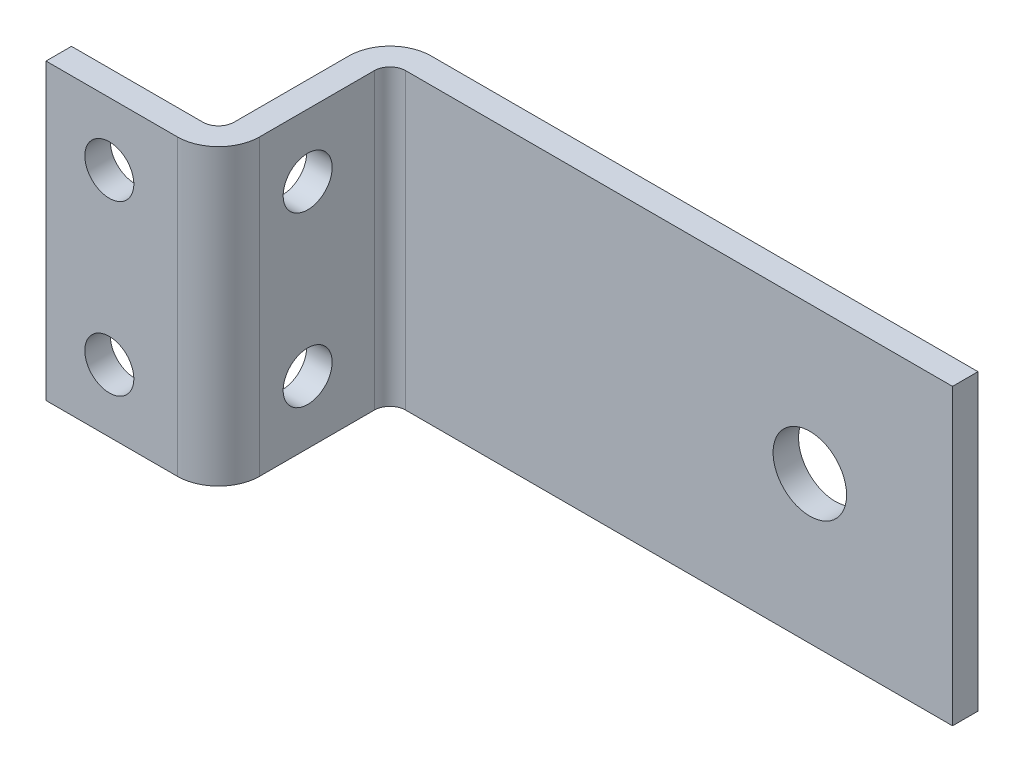
ISO-10303-21;
HEADER;
FILE_DESCRIPTION(('STEP AP214'),'2;1');
FILE_NAME('part.step','',(''),(''),'','','');
FILE_SCHEMA(('AUTOMOTIVE_DESIGN { 1 0 10303 214 1 1 1 1 }'));
ENDSEC;
DATA;
#1=APPLICATION_CONTEXT('core data for automotive mechanical design processes');
#2=APPLICATION_PROTOCOL_DEFINITION('international standard','automotive_design',2000,#1);
#3=PRODUCT_CONTEXT('',#1,'mechanical');
#4=PRODUCT('Part','Part','',(#3));
#5=PRODUCT_RELATED_PRODUCT_CATEGORY('part','',(#4));
#6=PRODUCT_DEFINITION_FORMATION('','',#4);
#7=PRODUCT_DEFINITION_CONTEXT('part definition',#1,'design');
#8=PRODUCT_DEFINITION('design','',#6,#7);
#9=PRODUCT_DEFINITION_SHAPE('','',#8);
#10=(LENGTH_UNIT() NAMED_UNIT(*) SI_UNIT(.MILLI.,.METRE.));
#11=(NAMED_UNIT(*) PLANE_ANGLE_UNIT() SI_UNIT($,.RADIAN.));
#12=(NAMED_UNIT(*) SI_UNIT($,.STERADIAN.) SOLID_ANGLE_UNIT());
#13=UNCERTAINTY_MEASURE_WITH_UNIT(LENGTH_MEASURE(1.E-05),#10,'distance_accuracy_value','');
#14=(GEOMETRIC_REPRESENTATION_CONTEXT(3) GLOBAL_UNCERTAINTY_ASSIGNED_CONTEXT((#13)) GLOBAL_UNIT_ASSIGNED_CONTEXT((#10,
#11,#12)) REPRESENTATION_CONTEXT('',''));
#15=CARTESIAN_POINT('',(0.,0.,0.));
#16=DIRECTION('',(0.,0.,1.));
#17=DIRECTION('',(1.,0.,0.));
#18=AXIS2_PLACEMENT_3D('',#15,#16,#17);
#19=CARTESIAN_POINT('',(-2.032,19.05,22.225));
#20=DIRECTION('',(0.,0.,-1.));
#21=DIRECTION('',(-1.,0.,0.));
#22=AXIS2_PLACEMENT_3D('',#19,#20,#21);
#23=PLANE('',#22);
#24=CARTESIAN_POINT('',(-10.8458,10.922,22.225));
#25=DIRECTION('',(0.,0.,-1.));
#26=DIRECTION('',(-1.,0.,0.));
#27=AXIS2_PLACEMENT_3D('',#24,#25,#26);
#28=CIRCLE('',#27,3.175);
#29=CARTESIAN_POINT('',(-14.0208,10.922,22.225));
#30=VERTEX_POINT('',#29);
#31=EDGE_CURVE('E170',#30,#30,#28,.F.);
#32=ORIENTED_EDGE('',*,*,#31,.T.);
#33=EDGE_LOOP('',(#32));
#34=FACE_BOUND('',#33,.T.);
#35=DIRECTION('',(1.,0.,0.));
#36=VECTOR('',#35,1.);
#37=CARTESIAN_POINT('',(-2.032,-19.05,22.225));
#38=LINE('',#37,#36);
#39=CARTESIAN_POINT('',(-19.05,-19.05,22.225));
#40=VERTEX_POINT('',#39);
#41=CARTESIAN_POINT('',(-2.032,-19.05,22.225));
#42=VERTEX_POINT('',#41);
#43=EDGE_CURVE('E190',#40,#42,#38,.T.);
#44=ORIENTED_EDGE('',*,*,#43,.F.);
#45=DIRECTION('',(0.,-1.,0.));
#46=VECTOR('',#45,1.);
#47=CARTESIAN_POINT('',(-19.05,19.05,22.225));
#48=LINE('',#47,#46);
#49=CARTESIAN_POINT('',(-19.05,19.05,22.225));
#50=VERTEX_POINT('',#49);
#51=EDGE_CURVE('E216',#50,#40,#48,.T.);
#52=ORIENTED_EDGE('',*,*,#51,.F.);
#53=DIRECTION('',(1.,0.,0.));
#54=VECTOR('',#53,1.);
#55=CARTESIAN_POINT('',(-2.032,19.05,22.225));
#56=LINE('',#55,#54);
#57=CARTESIAN_POINT('',(-2.032,19.05,22.225));
#58=VERTEX_POINT('',#57);
#59=EDGE_CURVE('E269',#50,#58,#56,.T.);
#60=ORIENTED_EDGE('',*,*,#59,.T.);
#61=DIRECTION('',(0.,-1.,0.));
#62=VECTOR('',#61,1.);
#63=CARTESIAN_POINT('',(-2.032,19.05,22.225));
#64=LINE('',#63,#62);
#65=EDGE_CURVE('E219',#58,#42,#64,.T.);
#66=ORIENTED_EDGE('',*,*,#65,.T.);
#67=EDGE_LOOP('',(#44,#52,#60,#66));
#68=FACE_BOUND('',#67,.T.);
#69=CARTESIAN_POINT('',(-10.8458,-10.922,22.225));
#70=DIRECTION('',(0.,0.,-1.));
#71=DIRECTION('',(-1.,0.,0.));
#72=AXIS2_PLACEMENT_3D('',#69,#70,#71);
#73=CIRCLE('',#72,3.175);
#74=CARTESIAN_POINT('',(-14.0208,-10.922,22.225));
#75=VERTEX_POINT('',#74);
#76=EDGE_CURVE('E301',#75,#75,#73,.F.);
#77=ORIENTED_EDGE('',*,*,#76,.T.);
#78=EDGE_LOOP('',(#77));
#79=FACE_BOUND('',#78,.T.);
#80=ADVANCED_FACE('F39',(#34,#68,#79),#23,.T.);
#81=CARTESIAN_POINT('',(-2.032,19.05,25.527));
#82=DIRECTION('',(0.,0.,-1.));
#83=DIRECTION('',(-1.,0.,0.));
#84=AXIS2_PLACEMENT_3D('',#81,#82,#83);
#85=PLANE('',#84);
#86=DIRECTION('',(1.,0.,0.));
#87=VECTOR('',#86,1.);
#88=CARTESIAN_POINT('',(-2.032,-19.05,25.527));
#89=LINE('',#88,#87);
#90=CARTESIAN_POINT('',(-19.05,-19.05,25.527));
#91=VERTEX_POINT('',#90);
#92=CARTESIAN_POINT('',(-2.032,-19.05,25.527));
#93=VERTEX_POINT('',#92);
#94=EDGE_CURVE('E198',#91,#93,#89,.T.);
#95=ORIENTED_EDGE('',*,*,#94,.T.);
#96=DIRECTION('',(0.,-1.,0.));
#97=VECTOR('',#96,1.);
#98=CARTESIAN_POINT('',(-2.032,19.05,25.527));
#99=LINE('',#98,#97);
#100=CARTESIAN_POINT('',(-2.032,19.05,25.527));
#101=VERTEX_POINT('',#100);
#102=EDGE_CURVE('E154',#101,#93,#99,.T.);
#103=ORIENTED_EDGE('',*,*,#102,.F.);
#104=DIRECTION('',(1.,0.,0.));
#105=VECTOR('',#104,1.);
#106=CARTESIAN_POINT('',(-2.032,19.05,25.527));
#107=LINE('',#106,#105);
#108=CARTESIAN_POINT('',(-19.05,19.05,25.527));
#109=VERTEX_POINT('',#108);
#110=EDGE_CURVE('E143',#109,#101,#107,.T.);
#111=ORIENTED_EDGE('',*,*,#110,.F.);
#112=DIRECTION('',(0.,-1.,0.));
#113=VECTOR('',#112,1.);
#114=CARTESIAN_POINT('',(-19.05,19.05,25.527));
#115=LINE('',#114,#113);
#116=EDGE_CURVE('E213',#109,#91,#115,.T.);
#117=ORIENTED_EDGE('',*,*,#116,.T.);
#118=EDGE_LOOP('',(#95,#103,#111,#117));
#119=FACE_BOUND('',#118,.T.);
#120=CARTESIAN_POINT('',(-10.8458,10.922,25.527));
#121=DIRECTION('',(0.,0.,-1.));
#122=DIRECTION('',(-1.,0.,0.));
#123=AXIS2_PLACEMENT_3D('',#120,#121,#122);
#124=CIRCLE('',#123,3.175);
#125=CARTESIAN_POINT('',(-14.0208,10.922,25.527));
#126=VERTEX_POINT('',#125);
#127=EDGE_CURVE('E295',#126,#126,#124,.T.);
#128=ORIENTED_EDGE('',*,*,#127,.T.);
#129=EDGE_LOOP('',(#128));
#130=FACE_BOUND('',#129,.T.);
#131=CARTESIAN_POINT('',(-10.8458,-10.922,25.527));
#132=DIRECTION('',(0.,0.,-1.));
#133=DIRECTION('',(-1.,0.,0.));
#134=AXIS2_PLACEMENT_3D('',#131,#132,#133);
#135=CIRCLE('',#134,3.175);
#136=CARTESIAN_POINT('',(-14.0208,-10.922,25.527));
#137=VERTEX_POINT('',#136);
#138=EDGE_CURVE('E298',#137,#137,#135,.T.);
#139=ORIENTED_EDGE('',*,*,#138,.T.);
#140=EDGE_LOOP('',(#139));
#141=FACE_BOUND('',#140,.T.);
#142=ADVANCED_FACE('F288',(#119,#130,#141),#85,.F.);
#143=CARTESIAN_POINT('',(5.334,19.05,3.302));
#144=DIRECTION('',(0.,0.,-1.));
#145=DIRECTION('',(-1.,0.,0.));
#146=AXIS2_PLACEMENT_3D('',#143,#144,#145);
#147=PLANE('',#146);
#148=CARTESIAN_POINT('',(57.7088,0.,3.302));
#149=DIRECTION('',(0.,0.,1.));
#150=DIRECTION('',(1.,0.,0.));
#151=AXIS2_PLACEMENT_3D('',#148,#149,#150);
#152=CIRCLE('',#151,4.7625);
#153=CARTESIAN_POINT('',(62.4713,0.,3.302));
#154=VERTEX_POINT('',#153);
#155=EDGE_CURVE('E363',#154,#154,#152,.T.);
#156=ORIENTED_EDGE('',*,*,#155,.F.);
#157=EDGE_LOOP('',(#156));
#158=FACE_BOUND('',#157,.T.);
#159=DIRECTION('',(1.,0.,0.));
#160=VECTOR('',#159,1.);
#161=CARTESIAN_POINT('',(5.334,-19.05,3.302));
#162=LINE('',#161,#160);
#163=CARTESIAN_POINT('',(5.334,-19.05,3.302));
#164=VERTEX_POINT('',#163);
#165=CARTESIAN_POINT('',(76.2,-19.05,3.302));
#166=VERTEX_POINT('',#165);
#167=EDGE_CURVE('E165',#164,#166,#162,.T.);
#168=ORIENTED_EDGE('',*,*,#167,.T.);
#169=DIRECTION('',(0.,-1.,0.));
#170=VECTOR('',#169,1.);
#171=CARTESIAN_POINT('',(76.2,19.05,3.302));
#172=LINE('',#171,#170);
#173=CARTESIAN_POINT('',(76.2,19.05,3.302));
#174=VERTEX_POINT('',#173);
#175=EDGE_CURVE('E11',#174,#166,#172,.T.);
#176=ORIENTED_EDGE('',*,*,#175,.F.);
#177=DIRECTION('',(1.,0.,0.));
#178=VECTOR('',#177,1.);
#179=CARTESIAN_POINT('',(5.334,19.05,3.302));
#180=LINE('',#179,#178);
#181=CARTESIAN_POINT('',(5.334,19.05,3.302));
#182=VERTEX_POINT('',#181);
#183=EDGE_CURVE('E109',#182,#174,#180,.T.);
#184=ORIENTED_EDGE('',*,*,#183,.F.);
#185=DIRECTION('',(0.,-1.,0.));
#186=VECTOR('',#185,1.);
#187=CARTESIAN_POINT('',(5.334,19.05,3.302));
#188=LINE('',#187,#186);
#189=EDGE_CURVE('E161',#182,#164,#188,.T.);
#190=ORIENTED_EDGE('',*,*,#189,.T.);
#191=EDGE_LOOP('',(#168,#176,#184,#190));
#192=FACE_BOUND('',#191,.T.);
#193=ADVANCED_FACE('F41',(#158,#192),#147,.F.);
#194=CARTESIAN_POINT('',(76.2,19.05,0.));
#195=DIRECTION('',(1.,0.,0.));
#196=DIRECTION('',(0.,0.,-1.));
#197=AXIS2_PLACEMENT_3D('',#194,#195,#196);
#198=PLANE('',#197);
#199=DIRECTION('',(0.,0.,1.));
#200=VECTOR('',#199,1.);
#201=CARTESIAN_POINT('',(76.2,-19.05,0.));
#202=LINE('',#201,#200);
#203=CARTESIAN_POINT('',(76.2,-19.05,0.));
#204=VERTEX_POINT('',#203);
#205=EDGE_CURVE('E169',#204,#166,#202,.T.);
#206=ORIENTED_EDGE('',*,*,#205,.F.);
#207=DIRECTION('',(0.,-1.,0.));
#208=VECTOR('',#207,1.);
#209=CARTESIAN_POINT('',(76.2,19.05,0.));
#210=LINE('',#209,#208);
#211=CARTESIAN_POINT('',(76.2,19.05,0.));
#212=VERTEX_POINT('',#211);
#213=EDGE_CURVE('E49',#212,#204,#210,.T.);
#214=ORIENTED_EDGE('',*,*,#213,.F.);
#215=DIRECTION('',(0.,0.,1.));
#216=VECTOR('',#215,1.);
#217=CARTESIAN_POINT('',(76.2,19.05,0.));
#218=LINE('',#217,#216);
#219=EDGE_CURVE('E253',#212,#174,#218,.T.);
#220=ORIENTED_EDGE('',*,*,#219,.T.);
#221=ORIENTED_EDGE('',*,*,#175,.T.);
#222=EDGE_LOOP('',(#206,#214,#220,#221));
#223=FACE_BOUND('',#222,.T.);
#224=ADVANCED_FACE('F240',(#223),#198,.T.);
#225=CARTESIAN_POINT('',(5.334,19.05,0.));
#226=DIRECTION('',(0.,0.,-1.));
#227=DIRECTION('',(-1.,0.,0.));
#228=AXIS2_PLACEMENT_3D('',#225,#226,#227);
#229=PLANE('',#228);
#230=CARTESIAN_POINT('',(57.7088,0.,0.));
#231=DIRECTION('',(0.,0.,1.));
#232=DIRECTION('',(1.,0.,0.));
#233=AXIS2_PLACEMENT_3D('',#230,#231,#232);
#234=CIRCLE('',#233,4.7625);
#235=CARTESIAN_POINT('',(62.4713,0.,0.));
#236=VERTEX_POINT('',#235);
#237=EDGE_CURVE('E501',#236,#236,#234,.T.);
#238=ORIENTED_EDGE('',*,*,#237,.T.);
#239=EDGE_LOOP('',(#238));
#240=FACE_BOUND('',#239,.T.);
#241=DIRECTION('',(1.,0.,0.));
#242=VECTOR('',#241,1.);
#243=CARTESIAN_POINT('',(5.334,-19.05,0.));
#244=LINE('',#243,#242);
#245=CARTESIAN_POINT('',(5.334,-19.05,0.));
#246=VERTEX_POINT('',#245);
#247=EDGE_CURVE('E174',#246,#204,#244,.T.);
#248=ORIENTED_EDGE('',*,*,#247,.F.);
#249=DIRECTION('',(0.,-1.,0.));
#250=VECTOR('',#249,1.);
#251=CARTESIAN_POINT('',(5.334,19.05,0.));
#252=LINE('',#251,#250);
#253=CARTESIAN_POINT('',(5.334,19.05,0.));
#254=VERTEX_POINT('',#253);
#255=EDGE_CURVE('E228',#254,#246,#252,.T.);
#256=ORIENTED_EDGE('',*,*,#255,.F.);
#257=DIRECTION('',(1.,0.,0.));
#258=VECTOR('',#257,1.);
#259=CARTESIAN_POINT('',(5.334,19.05,0.));
#260=LINE('',#259,#258);
#261=EDGE_CURVE('E237',#254,#212,#260,.T.);
#262=ORIENTED_EDGE('',*,*,#261,.T.);
#263=ORIENTED_EDGE('',*,*,#213,.T.);
#264=EDGE_LOOP('',(#248,#256,#262,#263));
#265=FACE_BOUND('',#264,.T.);
#266=ADVANCED_FACE('F235',(#240,#265),#229,.T.);
#267=CARTESIAN_POINT('',(5.334,19.05,5.334));
#268=DIRECTION('',(0.,-1.,0.));
#269=DIRECTION('',(0.,0.,-1.));
#270=AXIS2_PLACEMENT_3D('',#267,#268,#269);
#271=CYLINDRICAL_SURFACE('',#270,5.334);
#272=CARTESIAN_POINT('',(5.334,-19.05,5.334));
#273=DIRECTION('',(0.,-1.,0.));
#274=DIRECTION('',(0.,0.,-1.));
#275=AXIS2_PLACEMENT_3D('',#272,#273,#274);
#276=CIRCLE('',#275,5.334);
#277=CARTESIAN_POINT('',(0.,-19.05,5.334));
#278=VERTEX_POINT('',#277);
#279=EDGE_CURVE('E178',#278,#246,#276,.T.);
#280=ORIENTED_EDGE('',*,*,#279,.F.);
#281=DIRECTION('',(0.,-1.,0.));
#282=VECTOR('',#281,1.);
#283=CARTESIAN_POINT('',(0.,19.05,5.334));
#284=LINE('',#283,#282);
#285=CARTESIAN_POINT('',(0.,19.05,5.334));
#286=VERTEX_POINT('',#285);
#287=EDGE_CURVE('E225',#286,#278,#284,.T.);
#288=ORIENTED_EDGE('',*,*,#287,.F.);
#289=CARTESIAN_POINT('',(5.334,19.05,5.334));
#290=DIRECTION('',(0.,-1.,0.));
#291=DIRECTION('',(0.,0.,-1.));
#292=AXIS2_PLACEMENT_3D('',#289,#290,#291);
#293=CIRCLE('',#292,5.334);
#294=EDGE_CURVE('E250',#286,#254,#293,.T.);
#295=ORIENTED_EDGE('',*,*,#294,.T.);
#296=ORIENTED_EDGE('',*,*,#255,.T.);
#297=EDGE_LOOP('',(#280,#288,#295,#296));
#298=FACE_BOUND('',#297,.T.);
#299=ADVANCED_FACE('F247',(#298),#271,.T.);
#300=CARTESIAN_POINT('',(0.,19.05,20.193));
#301=DIRECTION('',(-1.,0.,0.));
#302=DIRECTION('',(0.,0.,1.));
#303=AXIS2_PLACEMENT_3D('',#300,#301,#302);
#304=PLANE('',#303);
#305=CARTESIAN_POINT('',(0.,-10.922,13.97));
#306=DIRECTION('',(-1.,0.,0.));
#307=DIRECTION('',(0.,0.,1.));
#308=AXIS2_PLACEMENT_3D('',#305,#306,#307);
#309=CIRCLE('',#308,3.175);
#310=CARTESIAN_POINT('',(0.,-10.922,17.145));
#311=VERTEX_POINT('',#310);
#312=EDGE_CURVE('E492',#311,#311,#309,.T.);
#313=ORIENTED_EDGE('',*,*,#312,.F.);
#314=EDGE_LOOP('',(#313));
#315=FACE_BOUND('',#314,.T.);
#316=CARTESIAN_POINT('',(0.,10.922,13.97));
#317=DIRECTION('',(-1.,0.,0.));
#318=DIRECTION('',(0.,0.,1.));
#319=AXIS2_PLACEMENT_3D('',#316,#317,#318);
#320=CIRCLE('',#319,3.175);
#321=CARTESIAN_POINT('',(0.,10.922,17.145));
#322=VERTEX_POINT('',#321);
#323=EDGE_CURVE('E302',#322,#322,#320,.T.);
#324=ORIENTED_EDGE('',*,*,#323,.F.);
#325=EDGE_LOOP('',(#324));
#326=FACE_BOUND('',#325,.T.);
#327=DIRECTION('',(0.,0.,-1.));
#328=VECTOR('',#327,1.);
#329=CARTESIAN_POINT('',(0.,-19.05,20.193));
#330=LINE('',#329,#328);
#331=CARTESIAN_POINT('',(0.,-19.05,20.193));
#332=VERTEX_POINT('',#331);
#333=EDGE_CURVE('E182',#332,#278,#330,.T.);
#334=ORIENTED_EDGE('',*,*,#333,.F.);
#335=DIRECTION('',(0.,-1.,0.));
#336=VECTOR('',#335,1.);
#337=CARTESIAN_POINT('',(0.,19.05,20.193));
#338=LINE('',#337,#336);
#339=CARTESIAN_POINT('',(0.,19.05,20.193));
#340=VERTEX_POINT('',#339);
#341=EDGE_CURVE('E222',#340,#332,#338,.T.);
#342=ORIENTED_EDGE('',*,*,#341,.F.);
#343=DIRECTION('',(0.,0.,-1.));
#344=VECTOR('',#343,1.);
#345=CARTESIAN_POINT('',(0.,19.05,20.193));
#346=LINE('',#345,#344);
#347=EDGE_CURVE('E258',#340,#286,#346,.T.);
#348=ORIENTED_EDGE('',*,*,#347,.T.);
#349=ORIENTED_EDGE('',*,*,#287,.T.);
#350=EDGE_LOOP('',(#334,#342,#348,#349));
#351=FACE_BOUND('',#350,.T.);
#352=ADVANCED_FACE('F344',(#315,#326,#351),#304,.T.);
#353=CARTESIAN_POINT('',(-2.032,19.05,20.193));
#354=DIRECTION('',(0.,-1.,0.));
#355=DIRECTION('',(0.,0.,-1.));
#356=AXIS2_PLACEMENT_3D('',#353,#354,#355);
#357=CYLINDRICAL_SURFACE('',#356,2.032);
#358=CARTESIAN_POINT('',(-2.032,-19.05,20.193));
#359=DIRECTION('',(0.,1.,0.));
#360=DIRECTION('',(0.,0.,-1.));
#361=AXIS2_PLACEMENT_3D('',#358,#359,#360);
#362=CIRCLE('',#361,2.032);
#363=EDGE_CURVE('E186',#42,#332,#362,.T.);
#364=ORIENTED_EDGE('',*,*,#363,.F.);
#365=ORIENTED_EDGE('',*,*,#65,.F.);
#366=CARTESIAN_POINT('',(-2.032,19.05,20.193));
#367=DIRECTION('',(0.,1.,0.));
#368=DIRECTION('',(0.,0.,-1.));
#369=AXIS2_PLACEMENT_3D('',#366,#367,#368);
#370=CIRCLE('',#369,2.032);
#371=EDGE_CURVE('E265',#58,#340,#370,.T.);
#372=ORIENTED_EDGE('',*,*,#371,.T.);
#373=ORIENTED_EDGE('',*,*,#341,.T.);
#374=EDGE_LOOP('',(#364,#365,#372,#373));
#375=FACE_BOUND('',#374,.T.);
#376=ADVANCED_FACE('F341',(#375),#357,.F.);
#377=CARTESIAN_POINT('',(-19.05,19.05,25.527));
#378=DIRECTION('',(-1.,0.,0.));
#379=DIRECTION('',(0.,0.,1.));
#380=AXIS2_PLACEMENT_3D('',#377,#378,#379);
#381=PLANE('',#380);
#382=DIRECTION('',(0.,0.,-1.));
#383=VECTOR('',#382,1.);
#384=CARTESIAN_POINT('',(-19.05,-19.05,25.527));
#385=LINE('',#384,#383);
#386=EDGE_CURVE('E194',#91,#40,#385,.T.);
#387=ORIENTED_EDGE('',*,*,#386,.F.);
#388=ORIENTED_EDGE('',*,*,#116,.F.);
#389=DIRECTION('',(0.,0.,-1.));
#390=VECTOR('',#389,1.);
#391=CARTESIAN_POINT('',(-19.05,19.05,25.527));
#392=LINE('',#391,#390);
#393=EDGE_CURVE('E273',#109,#50,#392,.T.);
#394=ORIENTED_EDGE('',*,*,#393,.T.);
#395=ORIENTED_EDGE('',*,*,#51,.T.);
#396=EDGE_LOOP('',(#387,#388,#394,#395));
#397=FACE_BOUND('',#396,.T.);
#398=ADVANCED_FACE('F279',(#397),#381,.T.);
#399=CARTESIAN_POINT('',(-2.032,19.05,20.193));
#400=DIRECTION('',(0.,-1.,0.));
#401=DIRECTION('',(0.,0.,-1.));
#402=AXIS2_PLACEMENT_3D('',#399,#400,#401);
#403=CYLINDRICAL_SURFACE('',#402,5.334);
#404=CARTESIAN_POINT('',(-2.032,-19.05,20.193));
#405=DIRECTION('',(0.,1.,0.));
#406=DIRECTION('',(1.,0.,0.));
#407=AXIS2_PLACEMENT_3D('',#404,#405,#406);
#408=CIRCLE('',#407,5.334);
#409=CARTESIAN_POINT('',(3.302,-19.05,20.193));
#410=VERTEX_POINT('',#409);
#411=EDGE_CURVE('E152',#93,#410,#408,.T.);
#412=ORIENTED_EDGE('',*,*,#411,.T.);
#413=DIRECTION('',(0.,-1.,0.));
#414=VECTOR('',#413,1.);
#415=CARTESIAN_POINT('',(3.302,19.05,20.193));
#416=LINE('',#415,#414);
#417=CARTESIAN_POINT('',(3.302,19.05,20.193));
#418=VERTEX_POINT('',#417);
#419=EDGE_CURVE('E149',#418,#410,#416,.T.);
#420=ORIENTED_EDGE('',*,*,#419,.F.);
#421=CARTESIAN_POINT('',(-2.032,19.05,20.193));
#422=DIRECTION('',(0.,1.,0.));
#423=DIRECTION('',(1.,0.,0.));
#424=AXIS2_PLACEMENT_3D('',#421,#422,#423);
#425=CIRCLE('',#424,5.334);
#426=EDGE_CURVE('E136',#101,#418,#425,.T.);
#427=ORIENTED_EDGE('',*,*,#426,.F.);
#428=ORIENTED_EDGE('',*,*,#102,.T.);
#429=EDGE_LOOP('',(#412,#420,#427,#428));
#430=FACE_BOUND('',#429,.T.);
#431=ADVANCED_FACE('F150',(#430),#403,.T.);
#432=CARTESIAN_POINT('',(3.302,19.05,20.193));
#433=DIRECTION('',(-1.,0.,0.));
#434=DIRECTION('',(0.,0.,1.));
#435=AXIS2_PLACEMENT_3D('',#432,#433,#434);
#436=PLANE('',#435);
#437=CARTESIAN_POINT('',(3.302,-10.922,13.97));
#438=DIRECTION('',(1.,0.,0.));
#439=DIRECTION('',(0.,0.,-1.));
#440=AXIS2_PLACEMENT_3D('',#437,#438,#439);
#441=CIRCLE('',#440,3.175);
#442=CARTESIAN_POINT('',(3.302,-10.922,10.795));
#443=VERTEX_POINT('',#442);
#444=EDGE_CURVE('E495',#443,#443,#441,.T.);
#445=ORIENTED_EDGE('',*,*,#444,.F.);
#446=EDGE_LOOP('',(#445));
#447=FACE_BOUND('',#446,.T.);
#448=CARTESIAN_POINT('',(3.302,10.922,13.97));
#449=DIRECTION('',(1.,0.,0.));
#450=DIRECTION('',(0.,0.,-1.));
#451=AXIS2_PLACEMENT_3D('',#448,#449,#450);
#452=CIRCLE('',#451,3.175);
#453=CARTESIAN_POINT('',(3.302,10.922,10.795));
#454=VERTEX_POINT('',#453);
#455=EDGE_CURVE('E309',#454,#454,#452,.T.);
#456=ORIENTED_EDGE('',*,*,#455,.F.);
#457=EDGE_LOOP('',(#456));
#458=FACE_BOUND('',#457,.T.);
#459=DIRECTION('',(0.,0.,-1.));
#460=VECTOR('',#459,1.);
#461=CARTESIAN_POINT('',(3.302,-19.05,20.193));
#462=LINE('',#461,#460);
#463=CARTESIAN_POINT('',(3.302,-19.05,5.334));
#464=VERTEX_POINT('',#463);
#465=EDGE_CURVE('E97',#410,#464,#462,.T.);
#466=ORIENTED_EDGE('',*,*,#465,.T.);
#467=DIRECTION('',(0.,-1.,0.));
#468=VECTOR('',#467,1.);
#469=CARTESIAN_POINT('',(3.302,19.05,5.334));
#470=LINE('',#469,#468);
#471=CARTESIAN_POINT('',(3.302,19.05,5.334));
#472=VERTEX_POINT('',#471);
#473=EDGE_CURVE('E155',#472,#464,#470,.T.);
#474=ORIENTED_EDGE('',*,*,#473,.F.);
#475=DIRECTION('',(0.,0.,-1.));
#476=VECTOR('',#475,1.);
#477=CARTESIAN_POINT('',(3.302,19.05,20.193));
#478=LINE('',#477,#476);
#479=EDGE_CURVE('E140',#418,#472,#478,.T.);
#480=ORIENTED_EDGE('',*,*,#479,.F.);
#481=ORIENTED_EDGE('',*,*,#419,.T.);
#482=EDGE_LOOP('',(#466,#474,#480,#481));
#483=FACE_BOUND('',#482,.T.);
#484=ADVANCED_FACE('F157',(#447,#458,#483),#436,.F.);
#485=CARTESIAN_POINT('',(5.334,19.05,5.334));
#486=DIRECTION('',(0.,-1.,0.));
#487=DIRECTION('',(0.,0.,-1.));
#488=AXIS2_PLACEMENT_3D('',#485,#486,#487);
#489=CYLINDRICAL_SURFACE('',#488,2.032);
#490=CARTESIAN_POINT('',(5.334,-19.05,5.334));
#491=DIRECTION('',(0.,1.,0.));
#492=DIRECTION('',(1.,0.,0.));
#493=AXIS2_PLACEMENT_3D('',#490,#491,#492);
#494=CIRCLE('',#493,2.032);
#495=EDGE_CURVE('E103',#464,#164,#494,.F.);
#496=ORIENTED_EDGE('',*,*,#495,.T.);
#497=ORIENTED_EDGE('',*,*,#189,.F.);
#498=CARTESIAN_POINT('',(5.334,19.05,5.334));
#499=DIRECTION('',(0.,1.,0.));
#500=DIRECTION('',(1.,0.,0.));
#501=AXIS2_PLACEMENT_3D('',#498,#499,#500);
#502=CIRCLE('',#501,2.032);
#503=EDGE_CURVE('E57',#472,#182,#502,.F.);
#504=ORIENTED_EDGE('',*,*,#503,.F.);
#505=ORIENTED_EDGE('',*,*,#473,.T.);
#506=EDGE_LOOP('',(#496,#497,#504,#505));
#507=FACE_BOUND('',#506,.T.);
#508=ADVANCED_FACE('F364',(#507),#489,.F.);
#509=CARTESIAN_POINT('',(5.334,19.05,5.334));
#510=DIRECTION('',(0.,-1.,0.));
#511=DIRECTION('',(-1.,0.,0.));
#512=AXIS2_PLACEMENT_3D('',#509,#510,#511);
#513=PLANE('',#512);
#514=ORIENTED_EDGE('',*,*,#183,.T.);
#515=ORIENTED_EDGE('',*,*,#219,.F.);
#516=ORIENTED_EDGE('',*,*,#261,.F.);
#517=ORIENTED_EDGE('',*,*,#294,.F.);
#518=ORIENTED_EDGE('',*,*,#347,.F.);
#519=ORIENTED_EDGE('',*,*,#371,.F.);
#520=ORIENTED_EDGE('',*,*,#59,.F.);
#521=ORIENTED_EDGE('',*,*,#393,.F.);
#522=ORIENTED_EDGE('',*,*,#110,.T.);
#523=ORIENTED_EDGE('',*,*,#426,.T.);
#524=ORIENTED_EDGE('',*,*,#479,.T.);
#525=ORIENTED_EDGE('',*,*,#503,.T.);
#526=EDGE_LOOP('',(#514,#515,#516,#517,#518,#519,#520,#521,#522,#523,#524,#525));
#527=FACE_BOUND('',#526,.T.);
#528=ADVANCED_FACE('F138',(#527),#513,.F.);
#529=CARTESIAN_POINT('',(5.334,-19.05,5.334));
#530=DIRECTION('',(0.,-1.,0.));
#531=DIRECTION('',(-1.,0.,0.));
#532=AXIS2_PLACEMENT_3D('',#529,#530,#531);
#533=PLANE('',#532);
#534=ORIENTED_EDGE('',*,*,#167,.F.);
#535=ORIENTED_EDGE('',*,*,#495,.F.);
#536=ORIENTED_EDGE('',*,*,#465,.F.);
#537=ORIENTED_EDGE('',*,*,#411,.F.);
#538=ORIENTED_EDGE('',*,*,#94,.F.);
#539=ORIENTED_EDGE('',*,*,#386,.T.);
#540=ORIENTED_EDGE('',*,*,#43,.T.);
#541=ORIENTED_EDGE('',*,*,#363,.T.);
#542=ORIENTED_EDGE('',*,*,#333,.T.);
#543=ORIENTED_EDGE('',*,*,#279,.T.);
#544=ORIENTED_EDGE('',*,*,#247,.T.);
#545=ORIENTED_EDGE('',*,*,#205,.T.);
#546=EDGE_LOOP('',(#534,#535,#536,#537,#538,#539,#540,#541,#542,#543,#544,#545));
#547=FACE_BOUND('',#546,.T.);
#548=ADVANCED_FACE('F243',(#547),#533,.T.);
#549=CARTESIAN_POINT('',(-10.8458,10.922,0.));
#550=DIRECTION('',(0.,0.,1.));
#551=DIRECTION('',(1.,0.,0.));
#552=AXIS2_PLACEMENT_3D('',#549,#550,#551);
#553=CYLINDRICAL_SURFACE('',#552,3.175);
#554=ORIENTED_EDGE('',*,*,#31,.F.);
#555=EDGE_LOOP('',(#554));
#556=FACE_BOUND('',#555,.T.);
#557=ORIENTED_EDGE('',*,*,#127,.F.);
#558=EDGE_LOOP('',(#557));
#559=FACE_BOUND('',#558,.T.);
#560=ADVANCED_FACE('F321',(#556,#559),#553,.F.);
#561=CARTESIAN_POINT('',(-10.8458,-10.922,0.));
#562=DIRECTION('',(0.,0.,1.));
#563=DIRECTION('',(1.,0.,0.));
#564=AXIS2_PLACEMENT_3D('',#561,#562,#563);
#565=CYLINDRICAL_SURFACE('',#564,3.175);
#566=ORIENTED_EDGE('',*,*,#76,.F.);
#567=EDGE_LOOP('',(#566));
#568=FACE_BOUND('',#567,.T.);
#569=ORIENTED_EDGE('',*,*,#138,.F.);
#570=EDGE_LOOP('',(#569));
#571=FACE_BOUND('',#570,.T.);
#572=ADVANCED_FACE('F324',(#568,#571),#565,.F.);
#573=CARTESIAN_POINT('',(-19.05,10.922,13.97));
#574=DIRECTION('',(1.,0.,0.));
#575=DIRECTION('',(0.,0.,-1.));
#576=AXIS2_PLACEMENT_3D('',#573,#574,#575);
#577=CYLINDRICAL_SURFACE('',#576,3.175);
#578=ORIENTED_EDGE('',*,*,#323,.T.);
#579=EDGE_LOOP('',(#578));
#580=FACE_BOUND('',#579,.T.);
#581=ORIENTED_EDGE('',*,*,#455,.T.);
#582=EDGE_LOOP('',(#581));
#583=FACE_BOUND('',#582,.T.);
#584=ADVANCED_FACE('F330',(#580,#583),#577,.F.);
#585=CARTESIAN_POINT('',(-19.05,-10.922,13.97));
#586=DIRECTION('',(1.,0.,0.));
#587=DIRECTION('',(0.,0.,-1.));
#588=AXIS2_PLACEMENT_3D('',#585,#586,#587);
#589=CYLINDRICAL_SURFACE('',#588,3.175);
#590=ORIENTED_EDGE('',*,*,#312,.T.);
#591=EDGE_LOOP('',(#590));
#592=FACE_BOUND('',#591,.T.);
#593=ORIENTED_EDGE('',*,*,#444,.T.);
#594=EDGE_LOOP('',(#593));
#595=FACE_BOUND('',#594,.T.);
#596=ADVANCED_FACE('F411',(#592,#595),#589,.F.);
#597=CARTESIAN_POINT('',(57.7088,0.,0.));
#598=DIRECTION('',(0.,0.,1.));
#599=DIRECTION('',(1.,0.,0.));
#600=AXIS2_PLACEMENT_3D('',#597,#598,#599);
#601=CYLINDRICAL_SURFACE('',#600,4.7625);
#602=ORIENTED_EDGE('',*,*,#237,.F.);
#603=EDGE_LOOP('',(#602));
#604=FACE_BOUND('',#603,.T.);
#605=ORIENTED_EDGE('',*,*,#155,.T.);
#606=EDGE_LOOP('',(#605));
#607=FACE_BOUND('',#606,.T.);
#608=ADVANCED_FACE('F407',(#604,#607),#601,.F.);
#609=CLOSED_SHELL('',(#80,#142,#193,#224,#266,#299,#352,#376,#398,#431,#484,#508,#528,#548,#560,
#572,#584,#596,#608));
#610=MANIFOLD_SOLID_BREP('B2',#609);
#611=ADVANCED_BREP_SHAPE_REPRESENTATION('',(#18,#610),#14);
#612=SHAPE_DEFINITION_REPRESENTATION(#9,#611);
ENDSEC;
END-ISO-10303-21;
